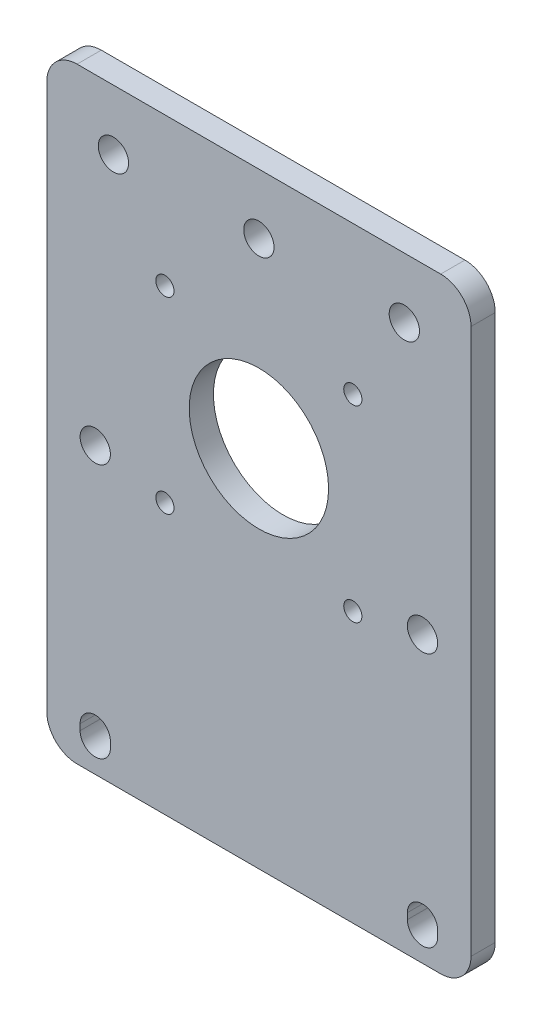
ISO-10303-21;
HEADER;
FILE_DESCRIPTION(('STEP AP214'),'2;1');
FILE_NAME('part.step','',(''),(''),'','','');
FILE_SCHEMA(('AUTOMOTIVE_DESIGN { 1 0 10303 214 1 1 1 1 }'));
ENDSEC;
DATA;
#1=APPLICATION_CONTEXT('core data for automotive mechanical design processes');
#2=APPLICATION_PROTOCOL_DEFINITION('international standard','automotive_design',2000,#1);
#3=PRODUCT_CONTEXT('',#1,'mechanical');
#4=PRODUCT('Part','Part','',(#3));
#5=PRODUCT_RELATED_PRODUCT_CATEGORY('part','',(#4));
#6=PRODUCT_DEFINITION_FORMATION('','',#4);
#7=PRODUCT_DEFINITION_CONTEXT('part definition',#1,'design');
#8=PRODUCT_DEFINITION('design','',#6,#7);
#9=PRODUCT_DEFINITION_SHAPE('','',#8);
#10=(LENGTH_UNIT() NAMED_UNIT(*) SI_UNIT(.MILLI.,.METRE.));
#11=(NAMED_UNIT(*) PLANE_ANGLE_UNIT() SI_UNIT($,.RADIAN.));
#12=(NAMED_UNIT(*) SI_UNIT($,.STERADIAN.) SOLID_ANGLE_UNIT());
#13=UNCERTAINTY_MEASURE_WITH_UNIT(LENGTH_MEASURE(1.E-05),#10,'distance_accuracy_value','');
#14=(GEOMETRIC_REPRESENTATION_CONTEXT(3) GLOBAL_UNCERTAINTY_ASSIGNED_CONTEXT((#13)) GLOBAL_UNIT_ASSIGNED_CONTEXT((#10,
#11,#12)) REPRESENTATION_CONTEXT('',''));
#15=CARTESIAN_POINT('',(0.,0.,0.));
#16=DIRECTION('',(0.,0.,1.));
#17=DIRECTION('',(1.,0.,0.));
#18=AXIS2_PLACEMENT_3D('',#15,#16,#17);
#19=CARTESIAN_POINT('',(0.,0.,4.));
#20=DIRECTION('',(0.,0.,1.));
#21=DIRECTION('',(1.,0.,0.));
#22=AXIS2_PLACEMENT_3D('',#19,#20,#21);
#23=PLANE('',#22);
#24=CARTESIAN_POINT('',(24.,40.076696830622,4.));
#25=DIRECTION('',(0.,0.,1.));
#26=DIRECTION('',(1.,0.,0.));
#27=AXIS2_PLACEMENT_3D('',#24,#25,#26);
#28=CIRCLE('',#27,2.5);
#29=CARTESIAN_POINT('',(26.5,40.076696830622,4.));
#30=VERTEX_POINT('',#29);
#31=EDGE_CURVE('E606',#30,#30,#28,.T.);
#32=ORIENTED_EDGE('',*,*,#31,.F.);
#33=EDGE_LOOP('',(#32));
#34=FACE_BOUND('',#33,.T.);
#35=CARTESIAN_POINT('',(-24.,40.076696830622,4.));
#36=DIRECTION('',(0.,0.,1.));
#37=DIRECTION('',(-1.,0.,0.));
#38=AXIS2_PLACEMENT_3D('',#35,#36,#37);
#39=CIRCLE('',#38,2.5);
#40=CARTESIAN_POINT('',(-26.5,40.076696830622,4.));
#41=VERTEX_POINT('',#40);
#42=EDGE_CURVE('E613',#41,#41,#39,.T.);
#43=ORIENTED_EDGE('',*,*,#42,.F.);
#44=EDGE_LOOP('',(#43));
#45=FACE_BOUND('',#44,.T.);
#46=CARTESIAN_POINT('',(0.,40.076696830622,4.));
#47=DIRECTION('',(0.,0.,1.));
#48=DIRECTION('',(1.,0.,0.));
#49=AXIS2_PLACEMENT_3D('',#46,#47,#48);
#50=CIRCLE('',#49,2.5);
#51=CARTESIAN_POINT('',(2.5,40.076696830622,4.));
#52=VERTEX_POINT('',#51);
#53=EDGE_CURVE('E619',#52,#52,#50,.T.);
#54=ORIENTED_EDGE('',*,*,#53,.F.);
#55=EDGE_LOOP('',(#54));
#56=FACE_BOUND('',#55,.T.);
#57=CARTESIAN_POINT('',(-15.5,-5.42330316937797,4.));
#58=DIRECTION('',(0.,0.,1.));
#59=DIRECTION('',(-1.,0.,0.));
#60=AXIS2_PLACEMENT_3D('',#57,#58,#59);
#61=CIRCLE('',#60,1.5);
#62=CARTESIAN_POINT('',(-17.,-5.42330316937797,4.));
#63=VERTEX_POINT('',#62);
#64=EDGE_CURVE('E624',#63,#63,#61,.T.);
#65=ORIENTED_EDGE('',*,*,#64,.F.);
#66=EDGE_LOOP('',(#65));
#67=FACE_BOUND('',#66,.T.);
#68=CARTESIAN_POINT('',(15.5,-5.42330316937798,4.));
#69=DIRECTION('',(0.,0.,1.));
#70=DIRECTION('',(1.,0.,0.));
#71=AXIS2_PLACEMENT_3D('',#68,#69,#70);
#72=CIRCLE('',#71,1.5);
#73=CARTESIAN_POINT('',(17.,-5.42330316937798,4.));
#74=VERTEX_POINT('',#73);
#75=EDGE_CURVE('E630',#74,#74,#72,.T.);
#76=ORIENTED_EDGE('',*,*,#75,.F.);
#77=EDGE_LOOP('',(#76));
#78=FACE_BOUND('',#77,.T.);
#79=CARTESIAN_POINT('',(15.5,25.576696830622,4.));
#80=DIRECTION('',(0.,0.,1.));
#81=DIRECTION('',(-1.,0.,0.));
#82=AXIS2_PLACEMENT_3D('',#79,#80,#81);
#83=CIRCLE('',#82,1.5);
#84=CARTESIAN_POINT('',(14.,25.576696830622,4.));
#85=VERTEX_POINT('',#84);
#86=EDGE_CURVE('E636',#85,#85,#83,.T.);
#87=ORIENTED_EDGE('',*,*,#86,.F.);
#88=EDGE_LOOP('',(#87));
#89=FACE_BOUND('',#88,.T.);
#90=CARTESIAN_POINT('',(-15.5,25.576696830622,4.));
#91=DIRECTION('',(0.,0.,1.));
#92=DIRECTION('',(1.,0.,0.));
#93=AXIS2_PLACEMENT_3D('',#90,#91,#92);
#94=CIRCLE('',#93,1.5);
#95=CARTESIAN_POINT('',(-14.,25.576696830622,4.));
#96=VERTEX_POINT('',#95);
#97=EDGE_CURVE('E642',#96,#96,#94,.T.);
#98=ORIENTED_EDGE('',*,*,#97,.F.);
#99=EDGE_LOOP('',(#98));
#100=FACE_BOUND('',#99,.T.);
#101=CARTESIAN_POINT('',(0.,10.076696830622,4.));
#102=DIRECTION('',(0.,0.,1.));
#103=DIRECTION('',(1.,0.,0.));
#104=AXIS2_PLACEMENT_3D('',#101,#102,#103);
#105=CIRCLE('',#104,11.5);
#106=CARTESIAN_POINT('',(11.5,10.076696830622,4.));
#107=VERTEX_POINT('',#106);
#108=EDGE_CURVE('E648',#107,#107,#105,.T.);
#109=ORIENTED_EDGE('',*,*,#108,.F.);
#110=EDGE_LOOP('',(#109));
#111=FACE_BOUND('',#110,.T.);
#112=DIRECTION('',(0.,-1.,0.));
#113=VECTOR('',#112,1.);
#114=CARTESIAN_POINT('',(24.5,-44.,4.));
#115=LINE('',#114,#113);
#116=CARTESIAN_POINT('',(24.5,-44.,4.));
#117=VERTEX_POINT('',#116);
#118=CARTESIAN_POINT('',(24.5,-45.,4.));
#119=VERTEX_POINT('',#118);
#120=EDGE_CURVE('E160',#117,#119,#115,.T.);
#121=ORIENTED_EDGE('',*,*,#120,.F.);
#122=CARTESIAN_POINT('',(27.,-44.,4.));
#123=DIRECTION('',(0.,0.,1.));
#124=DIRECTION('',(-1.,0.,0.));
#125=AXIS2_PLACEMENT_3D('',#122,#123,#124);
#126=CIRCLE('',#125,2.5);
#127=CARTESIAN_POINT('',(29.5,-44.,4.));
#128=VERTEX_POINT('',#127);
#129=EDGE_CURVE('E150',#128,#117,#126,.T.);
#130=ORIENTED_EDGE('',*,*,#129,.F.);
#131=DIRECTION('',(0.,1.,0.));
#132=VECTOR('',#131,1.);
#133=CARTESIAN_POINT('',(29.5,-44.,4.));
#134=LINE('',#133,#132);
#135=CARTESIAN_POINT('',(29.5,-45.,4.));
#136=VERTEX_POINT('',#135);
#137=EDGE_CURVE('E177',#136,#128,#134,.T.);
#138=ORIENTED_EDGE('',*,*,#137,.F.);
#139=CARTESIAN_POINT('',(27.,-45.,4.));
#140=DIRECTION('',(0.,0.,1.));
#141=DIRECTION('',(-1.,0.,0.));
#142=AXIS2_PLACEMENT_3D('',#139,#140,#141);
#143=CIRCLE('',#142,2.5);
#144=EDGE_CURVE('E174',#119,#136,#143,.T.);
#145=ORIENTED_EDGE('',*,*,#144,.F.);
#146=EDGE_LOOP('',(#121,#130,#138,#145));
#147=FACE_BOUND('',#146,.T.);
#148=DIRECTION('',(0.,-1.,0.));
#149=VECTOR('',#148,1.);
#150=CARTESIAN_POINT('',(-29.5,-44.,4.));
#151=LINE('',#150,#149);
#152=CARTESIAN_POINT('',(-29.5,-44.,4.));
#153=VERTEX_POINT('',#152);
#154=CARTESIAN_POINT('',(-29.5,-45.,4.));
#155=VERTEX_POINT('',#154);
#156=EDGE_CURVE('E197',#153,#155,#151,.T.);
#157=ORIENTED_EDGE('',*,*,#156,.F.);
#158=CARTESIAN_POINT('',(-27.,-44.,4.));
#159=DIRECTION('',(0.,0.,1.));
#160=DIRECTION('',(1.,0.,0.));
#161=AXIS2_PLACEMENT_3D('',#158,#159,#160);
#162=CIRCLE('',#161,2.5);
#163=CARTESIAN_POINT('',(-24.5,-44.,4.));
#164=VERTEX_POINT('',#163);
#165=EDGE_CURVE('E195',#164,#153,#162,.T.);
#166=ORIENTED_EDGE('',*,*,#165,.F.);
#167=DIRECTION('',(0.,1.,0.));
#168=VECTOR('',#167,1.);
#169=CARTESIAN_POINT('',(-24.5,-44.,4.));
#170=LINE('',#169,#168);
#171=CARTESIAN_POINT('',(-24.5,-45.,4.));
#172=VERTEX_POINT('',#171);
#173=EDGE_CURVE('E204',#172,#164,#170,.T.);
#174=ORIENTED_EDGE('',*,*,#173,.F.);
#175=CARTESIAN_POINT('',(-27.,-45.,4.));
#176=DIRECTION('',(0.,0.,1.));
#177=DIRECTION('',(1.,0.,0.));
#178=AXIS2_PLACEMENT_3D('',#175,#176,#177);
#179=CIRCLE('',#178,2.5);
#180=EDGE_CURVE('E200',#155,#172,#179,.T.);
#181=ORIENTED_EDGE('',*,*,#180,.F.);
#182=EDGE_LOOP('',(#157,#166,#174,#181));
#183=FACE_BOUND('',#182,.T.);
#184=CARTESIAN_POINT('',(-27.,-3.,4.));
#185=DIRECTION('',(0.,0.,1.));
#186=DIRECTION('',(1.,0.,0.));
#187=AXIS2_PLACEMENT_3D('',#184,#185,#186);
#188=CIRCLE('',#187,2.5);
#189=CARTESIAN_POINT('',(-24.5,-3.,4.));
#190=VERTEX_POINT('',#189);
#191=EDGE_CURVE('E227',#190,#190,#188,.T.);
#192=ORIENTED_EDGE('',*,*,#191,.F.);
#193=EDGE_LOOP('',(#192));
#194=FACE_BOUND('',#193,.T.);
#195=DIRECTION('',(0.,-1.,0.));
#196=VECTOR('',#195,1.);
#197=CARTESIAN_POINT('',(-35.,50.,4.));
#198=LINE('',#197,#196);
#199=CARTESIAN_POINT('',(-35.,45.,4.));
#200=VERTEX_POINT('',#199);
#201=CARTESIAN_POINT('',(-35.,-45.,4.));
#202=VERTEX_POINT('',#201);
#203=EDGE_CURVE('E239',#200,#202,#198,.T.);
#204=ORIENTED_EDGE('',*,*,#203,.T.);
#205=CARTESIAN_POINT('',(-30.,-45.,4.));
#206=DIRECTION('',(0.,0.,1.));
#207=DIRECTION('',(1.,0.,0.));
#208=AXIS2_PLACEMENT_3D('',#205,#206,#207);
#209=CIRCLE('',#208,5.);
#210=CARTESIAN_POINT('',(-30.,-50.,4.));
#211=VERTEX_POINT('',#210);
#212=EDGE_CURVE('E278',#202,#211,#209,.T.);
#213=ORIENTED_EDGE('',*,*,#212,.T.);
#214=DIRECTION('',(1.,0.,0.));
#215=VECTOR('',#214,1.);
#216=CARTESIAN_POINT('',(-35.,-50.,4.));
#217=LINE('',#216,#215);
#218=CARTESIAN_POINT('',(30.,-50.,4.));
#219=VERTEX_POINT('',#218);
#220=EDGE_CURVE('E243',#211,#219,#217,.T.);
#221=ORIENTED_EDGE('',*,*,#220,.T.);
#222=CARTESIAN_POINT('',(30.,-45.,4.));
#223=DIRECTION('',(0.,0.,1.));
#224=DIRECTION('',(1.,0.,0.));
#225=AXIS2_PLACEMENT_3D('',#222,#223,#224);
#226=CIRCLE('',#225,5.);
#227=CARTESIAN_POINT('',(35.,-45.,4.));
#228=VERTEX_POINT('',#227);
#229=EDGE_CURVE('E276',#219,#228,#226,.T.);
#230=ORIENTED_EDGE('',*,*,#229,.T.);
#231=DIRECTION('',(0.,1.,0.));
#232=VECTOR('',#231,1.);
#233=CARTESIAN_POINT('',(35.,50.,4.));
#234=LINE('',#233,#232);
#235=CARTESIAN_POINT('',(35.,45.,4.));
#236=VERTEX_POINT('',#235);
#237=EDGE_CURVE('E234',#228,#236,#234,.T.);
#238=ORIENTED_EDGE('',*,*,#237,.T.);
#239=CARTESIAN_POINT('',(30.,45.,4.));
#240=DIRECTION('',(0.,0.,1.));
#241=DIRECTION('',(1.,0.,0.));
#242=AXIS2_PLACEMENT_3D('',#239,#240,#241);
#243=CIRCLE('',#242,5.);
#244=CARTESIAN_POINT('',(30.,50.,4.));
#245=VERTEX_POINT('',#244);
#246=EDGE_CURVE('E56',#236,#245,#243,.T.);
#247=ORIENTED_EDGE('',*,*,#246,.T.);
#248=DIRECTION('',(-1.,0.,0.));
#249=VECTOR('',#248,1.);
#250=CARTESIAN_POINT('',(-35.,50.,4.));
#251=LINE('',#250,#249);
#252=CARTESIAN_POINT('',(-30.,50.,4.));
#253=VERTEX_POINT('',#252);
#254=EDGE_CURVE('E236',#245,#253,#251,.T.);
#255=ORIENTED_EDGE('',*,*,#254,.T.);
#256=CARTESIAN_POINT('',(-30.,45.,4.));
#257=DIRECTION('',(0.,0.,1.));
#258=DIRECTION('',(1.,0.,0.));
#259=AXIS2_PLACEMENT_3D('',#256,#257,#258);
#260=CIRCLE('',#259,5.);
#261=EDGE_CURVE('E273',#253,#200,#260,.T.);
#262=ORIENTED_EDGE('',*,*,#261,.T.);
#263=EDGE_LOOP('',(#204,#213,#221,#230,#238,#247,#255,#262));
#264=FACE_BOUND('',#263,.T.);
#265=CARTESIAN_POINT('',(27.,-3.,4.));
#266=DIRECTION('',(0.,0.,1.));
#267=DIRECTION('',(-1.,0.,0.));
#268=AXIS2_PLACEMENT_3D('',#265,#266,#267);
#269=CIRCLE('',#268,2.5);
#270=CARTESIAN_POINT('',(24.5,-3.,4.));
#271=VERTEX_POINT('',#270);
#272=EDGE_CURVE('E184',#271,#271,#269,.T.);
#273=ORIENTED_EDGE('',*,*,#272,.F.);
#274=EDGE_LOOP('',(#273));
#275=FACE_BOUND('',#274,.T.);
#276=ADVANCED_FACE('F35',(#34,#45,#56,#67,#78,#89,#100,#111,#147,#183,#194,#264,#275),#23,.T.);
#277=CARTESIAN_POINT('',(0.,0.,0.));
#278=DIRECTION('',(0.,0.,1.));
#279=DIRECTION('',(1.,0.,0.));
#280=AXIS2_PLACEMENT_3D('',#277,#278,#279);
#281=PLANE('',#280);
#282=CARTESIAN_POINT('',(24.,40.076696830622,0.));
#283=DIRECTION('',(0.,0.,1.));
#284=DIRECTION('',(1.,0.,0.));
#285=AXIS2_PLACEMENT_3D('',#282,#283,#284);
#286=CIRCLE('',#285,2.5);
#287=CARTESIAN_POINT('',(26.5,40.076696830622,0.));
#288=VERTEX_POINT('',#287);
#289=EDGE_CURVE('E610',#288,#288,#286,.T.);
#290=ORIENTED_EDGE('',*,*,#289,.T.);
#291=EDGE_LOOP('',(#290));
#292=FACE_BOUND('',#291,.T.);
#293=CARTESIAN_POINT('',(-24.,40.076696830622,0.));
#294=DIRECTION('',(0.,0.,1.));
#295=DIRECTION('',(-1.,0.,0.));
#296=AXIS2_PLACEMENT_3D('',#293,#294,#295);
#297=CIRCLE('',#296,2.5);
#298=CARTESIAN_POINT('',(-26.5,40.076696830622,0.));
#299=VERTEX_POINT('',#298);
#300=EDGE_CURVE('E611',#299,#299,#297,.T.);
#301=ORIENTED_EDGE('',*,*,#300,.T.);
#302=EDGE_LOOP('',(#301));
#303=FACE_BOUND('',#302,.T.);
#304=CARTESIAN_POINT('',(0.,40.076696830622,0.));
#305=DIRECTION('',(0.,0.,1.));
#306=DIRECTION('',(1.,0.,0.));
#307=AXIS2_PLACEMENT_3D('',#304,#305,#306);
#308=CIRCLE('',#307,2.5);
#309=CARTESIAN_POINT('',(2.5,40.076696830622,0.));
#310=VERTEX_POINT('',#309);
#311=EDGE_CURVE('E617',#310,#310,#308,.T.);
#312=ORIENTED_EDGE('',*,*,#311,.T.);
#313=EDGE_LOOP('',(#312));
#314=FACE_BOUND('',#313,.T.);
#315=CARTESIAN_POINT('',(-15.5,-5.42330316937797,0.));
#316=DIRECTION('',(0.,0.,1.));
#317=DIRECTION('',(-1.,0.,0.));
#318=AXIS2_PLACEMENT_3D('',#315,#316,#317);
#319=CIRCLE('',#318,1.5);
#320=CARTESIAN_POINT('',(-17.,-5.42330316937797,0.));
#321=VERTEX_POINT('',#320);
#322=EDGE_CURVE('E628',#321,#321,#319,.T.);
#323=ORIENTED_EDGE('',*,*,#322,.T.);
#324=EDGE_LOOP('',(#323));
#325=FACE_BOUND('',#324,.T.);
#326=CARTESIAN_POINT('',(15.5,-5.42330316937798,0.));
#327=DIRECTION('',(0.,0.,1.));
#328=DIRECTION('',(1.,0.,0.));
#329=AXIS2_PLACEMENT_3D('',#326,#327,#328);
#330=CIRCLE('',#329,1.5);
#331=CARTESIAN_POINT('',(17.,-5.42330316937798,0.));
#332=VERTEX_POINT('',#331);
#333=EDGE_CURVE('E634',#332,#332,#330,.T.);
#334=ORIENTED_EDGE('',*,*,#333,.T.);
#335=EDGE_LOOP('',(#334));
#336=FACE_BOUND('',#335,.T.);
#337=CARTESIAN_POINT('',(15.5,25.576696830622,0.));
#338=DIRECTION('',(0.,0.,1.));
#339=DIRECTION('',(-1.,0.,0.));
#340=AXIS2_PLACEMENT_3D('',#337,#338,#339);
#341=CIRCLE('',#340,1.5);
#342=CARTESIAN_POINT('',(14.,25.576696830622,0.));
#343=VERTEX_POINT('',#342);
#344=EDGE_CURVE('E640',#343,#343,#341,.T.);
#345=ORIENTED_EDGE('',*,*,#344,.T.);
#346=EDGE_LOOP('',(#345));
#347=FACE_BOUND('',#346,.T.);
#348=CARTESIAN_POINT('',(-15.5,25.576696830622,0.));
#349=DIRECTION('',(0.,0.,1.));
#350=DIRECTION('',(1.,0.,0.));
#351=AXIS2_PLACEMENT_3D('',#348,#349,#350);
#352=CIRCLE('',#351,1.5);
#353=CARTESIAN_POINT('',(-14.,25.576696830622,0.));
#354=VERTEX_POINT('',#353);
#355=EDGE_CURVE('E646',#354,#354,#352,.T.);
#356=ORIENTED_EDGE('',*,*,#355,.T.);
#357=EDGE_LOOP('',(#356));
#358=FACE_BOUND('',#357,.T.);
#359=CARTESIAN_POINT('',(0.,10.076696830622,0.));
#360=DIRECTION('',(0.,0.,1.));
#361=DIRECTION('',(1.,0.,0.));
#362=AXIS2_PLACEMENT_3D('',#359,#360,#361);
#363=CIRCLE('',#362,11.5);
#364=CARTESIAN_POINT('',(11.5,10.076696830622,0.));
#365=VERTEX_POINT('',#364);
#366=EDGE_CURVE('E651',#365,#365,#363,.T.);
#367=ORIENTED_EDGE('',*,*,#366,.T.);
#368=EDGE_LOOP('',(#367));
#369=FACE_BOUND('',#368,.T.);
#370=CARTESIAN_POINT('',(-27.,-44.,0.));
#371=DIRECTION('',(0.,0.,1.));
#372=DIRECTION('',(1.,0.,0.));
#373=AXIS2_PLACEMENT_3D('',#370,#371,#372);
#374=CIRCLE('',#373,2.5);
#375=CARTESIAN_POINT('',(-24.5,-44.,0.));
#376=VERTEX_POINT('',#375);
#377=CARTESIAN_POINT('',(-29.5,-44.,0.));
#378=VERTEX_POINT('',#377);
#379=EDGE_CURVE('E168',#376,#378,#374,.T.);
#380=ORIENTED_EDGE('',*,*,#379,.T.);
#381=DIRECTION('',(0.,-1.,0.));
#382=VECTOR('',#381,1.);
#383=CARTESIAN_POINT('',(-29.5,-44.,0.));
#384=LINE('',#383,#382);
#385=CARTESIAN_POINT('',(-29.5,-45.,0.));
#386=VERTEX_POINT('',#385);
#387=EDGE_CURVE('E209',#378,#386,#384,.T.);
#388=ORIENTED_EDGE('',*,*,#387,.T.);
#389=CARTESIAN_POINT('',(-27.,-45.,0.));
#390=DIRECTION('',(0.,0.,1.));
#391=DIRECTION('',(1.,0.,0.));
#392=AXIS2_PLACEMENT_3D('',#389,#390,#391);
#393=CIRCLE('',#392,2.5);
#394=CARTESIAN_POINT('',(-24.5,-45.,0.));
#395=VERTEX_POINT('',#394);
#396=EDGE_CURVE('E212',#386,#395,#393,.T.);
#397=ORIENTED_EDGE('',*,*,#396,.T.);
#398=DIRECTION('',(0.,1.,0.));
#399=VECTOR('',#398,1.);
#400=CARTESIAN_POINT('',(-24.5,-44.,0.));
#401=LINE('',#400,#399);
#402=EDGE_CURVE('E198',#395,#376,#401,.T.);
#403=ORIENTED_EDGE('',*,*,#402,.T.);
#404=EDGE_LOOP('',(#380,#388,#397,#403));
#405=FACE_BOUND('',#404,.T.);
#406=DIRECTION('',(1.,0.,0.));
#407=VECTOR('',#406,1.);
#408=CARTESIAN_POINT('',(-35.,-50.,0.));
#409=LINE('',#408,#407);
#410=CARTESIAN_POINT('',(-30.,-50.,0.));
#411=VERTEX_POINT('',#410);
#412=CARTESIAN_POINT('',(30.,-50.,0.));
#413=VERTEX_POINT('',#412);
#414=EDGE_CURVE('E237',#411,#413,#409,.T.);
#415=ORIENTED_EDGE('',*,*,#414,.F.);
#416=CARTESIAN_POINT('',(-30.,-45.,0.));
#417=DIRECTION('',(0.,0.,1.));
#418=DIRECTION('',(1.,0.,0.));
#419=AXIS2_PLACEMENT_3D('',#416,#417,#418);
#420=CIRCLE('',#419,5.);
#421=CARTESIAN_POINT('',(-35.,-45.,0.));
#422=VERTEX_POINT('',#421);
#423=EDGE_CURVE('E266',#411,#422,#420,.F.);
#424=ORIENTED_EDGE('',*,*,#423,.T.);
#425=DIRECTION('',(0.,-1.,0.));
#426=VECTOR('',#425,1.);
#427=CARTESIAN_POINT('',(-35.,50.,0.));
#428=LINE('',#427,#426);
#429=CARTESIAN_POINT('',(-35.,45.,0.));
#430=VERTEX_POINT('',#429);
#431=EDGE_CURVE('E251',#430,#422,#428,.T.);
#432=ORIENTED_EDGE('',*,*,#431,.F.);
#433=CARTESIAN_POINT('',(-30.,45.,0.));
#434=DIRECTION('',(0.,0.,1.));
#435=DIRECTION('',(1.,0.,0.));
#436=AXIS2_PLACEMENT_3D('',#433,#434,#435);
#437=CIRCLE('',#436,5.);
#438=CARTESIAN_POINT('',(-30.,50.,0.));
#439=VERTEX_POINT('',#438);
#440=EDGE_CURVE('E260',#430,#439,#437,.F.);
#441=ORIENTED_EDGE('',*,*,#440,.T.);
#442=DIRECTION('',(-1.,0.,0.));
#443=VECTOR('',#442,1.);
#444=CARTESIAN_POINT('',(-35.,50.,0.));
#445=LINE('',#444,#443);
#446=CARTESIAN_POINT('',(30.,50.,0.));
#447=VERTEX_POINT('',#446);
#448=EDGE_CURVE('E249',#447,#439,#445,.T.);
#449=ORIENTED_EDGE('',*,*,#448,.F.);
#450=CARTESIAN_POINT('',(30.,45.,0.));
#451=DIRECTION('',(0.,0.,1.));
#452=DIRECTION('',(1.,0.,0.));
#453=AXIS2_PLACEMENT_3D('',#450,#451,#452);
#454=CIRCLE('',#453,5.);
#455=CARTESIAN_POINT('',(35.,45.,0.));
#456=VERTEX_POINT('',#455);
#457=EDGE_CURVE('E262',#447,#456,#454,.F.);
#458=ORIENTED_EDGE('',*,*,#457,.T.);
#459=DIRECTION('',(0.,1.,0.));
#460=VECTOR('',#459,1.);
#461=CARTESIAN_POINT('',(35.,50.,0.));
#462=LINE('',#461,#460);
#463=CARTESIAN_POINT('',(35.,-45.,0.));
#464=VERTEX_POINT('',#463);
#465=EDGE_CURVE('E231',#464,#456,#462,.T.);
#466=ORIENTED_EDGE('',*,*,#465,.F.);
#467=CARTESIAN_POINT('',(30.,-45.,0.));
#468=DIRECTION('',(0.,0.,1.));
#469=DIRECTION('',(1.,0.,0.));
#470=AXIS2_PLACEMENT_3D('',#467,#468,#469);
#471=CIRCLE('',#470,5.);
#472=EDGE_CURVE('E264',#464,#413,#471,.F.);
#473=ORIENTED_EDGE('',*,*,#472,.T.);
#474=EDGE_LOOP('',(#415,#424,#432,#441,#449,#458,#466,#473));
#475=FACE_BOUND('',#474,.T.);
#476=CARTESIAN_POINT('',(-27.,-3.,0.));
#477=DIRECTION('',(0.,0.,1.));
#478=DIRECTION('',(1.,0.,0.));
#479=AXIS2_PLACEMENT_3D('',#476,#477,#478);
#480=CIRCLE('',#479,2.5);
#481=CARTESIAN_POINT('',(-24.5,-3.,0.));
#482=VERTEX_POINT('',#481);
#483=EDGE_CURVE('E226',#482,#482,#480,.T.);
#484=ORIENTED_EDGE('',*,*,#483,.T.);
#485=EDGE_LOOP('',(#484));
#486=FACE_BOUND('',#485,.T.);
#487=CARTESIAN_POINT('',(27.,-44.,0.));
#488=DIRECTION('',(0.,0.,1.));
#489=DIRECTION('',(-1.,0.,0.));
#490=AXIS2_PLACEMENT_3D('',#487,#488,#489);
#491=CIRCLE('',#490,2.5);
#492=CARTESIAN_POINT('',(29.5,-44.,0.));
#493=VERTEX_POINT('',#492);
#494=CARTESIAN_POINT('',(24.5,-44.,0.));
#495=VERTEX_POINT('',#494);
#496=EDGE_CURVE('E182',#493,#495,#491,.T.);
#497=ORIENTED_EDGE('',*,*,#496,.T.);
#498=DIRECTION('',(0.,-1.,0.));
#499=VECTOR('',#498,1.);
#500=CARTESIAN_POINT('',(24.5,-44.,0.));
#501=LINE('',#500,#499);
#502=CARTESIAN_POINT('',(24.5,-45.,0.));
#503=VERTEX_POINT('',#502);
#504=EDGE_CURVE('E167',#495,#503,#501,.T.);
#505=ORIENTED_EDGE('',*,*,#504,.T.);
#506=CARTESIAN_POINT('',(27.,-45.,0.));
#507=DIRECTION('',(0.,0.,1.));
#508=DIRECTION('',(-1.,0.,0.));
#509=AXIS2_PLACEMENT_3D('',#506,#507,#508);
#510=CIRCLE('',#509,2.5);
#511=CARTESIAN_POINT('',(29.5,-45.,0.));
#512=VERTEX_POINT('',#511);
#513=EDGE_CURVE('E186',#503,#512,#510,.T.);
#514=ORIENTED_EDGE('',*,*,#513,.T.);
#515=DIRECTION('',(0.,1.,0.));
#516=VECTOR('',#515,1.);
#517=CARTESIAN_POINT('',(29.5,-44.,0.));
#518=LINE('',#517,#516);
#519=EDGE_CURVE('E161',#512,#493,#518,.T.);
#520=ORIENTED_EDGE('',*,*,#519,.T.);
#521=EDGE_LOOP('',(#497,#505,#514,#520));
#522=FACE_BOUND('',#521,.T.);
#523=CARTESIAN_POINT('',(27.,-3.,0.));
#524=DIRECTION('',(0.,0.,1.));
#525=DIRECTION('',(-1.,0.,0.));
#526=AXIS2_PLACEMENT_3D('',#523,#524,#525);
#527=CIRCLE('',#526,2.5);
#528=CARTESIAN_POINT('',(24.5,-3.,0.));
#529=VERTEX_POINT('',#528);
#530=EDGE_CURVE('E659',#529,#529,#527,.T.);
#531=ORIENTED_EDGE('',*,*,#530,.T.);
#532=EDGE_LOOP('',(#531));
#533=FACE_BOUND('',#532,.T.);
#534=ADVANCED_FACE('F294',(#292,#303,#314,#325,#336,#347,#358,#369,#405,#475,#486,#522,#533),
#281,.F.);
#535=CARTESIAN_POINT('',(35.,50.,4.));
#536=DIRECTION('',(-1.,0.,0.));
#537=DIRECTION('',(0.,-1.,0.));
#538=AXIS2_PLACEMENT_3D('',#535,#536,#537);
#539=PLANE('',#538);
#540=ORIENTED_EDGE('',*,*,#237,.F.);
#541=DIRECTION('',(0.,0.,-1.));
#542=VECTOR('',#541,1.);
#543=CARTESIAN_POINT('',(35.,-45.,4.));
#544=LINE('',#543,#542);
#545=EDGE_CURVE('E282',#228,#464,#544,.T.);
#546=ORIENTED_EDGE('',*,*,#545,.T.);
#547=ORIENTED_EDGE('',*,*,#465,.T.);
#548=DIRECTION('',(0.,0.,-1.));
#549=VECTOR('',#548,1.);
#550=CARTESIAN_POINT('',(35.,45.,4.));
#551=LINE('',#550,#549);
#552=EDGE_CURVE('E280',#456,#236,#551,.F.);
#553=ORIENTED_EDGE('',*,*,#552,.T.);
#554=EDGE_LOOP('',(#540,#546,#547,#553));
#555=FACE_BOUND('',#554,.T.);
#556=ADVANCED_FACE('F288',(#555),#539,.F.);
#557=CARTESIAN_POINT('',(-35.,50.,4.));
#558=DIRECTION('',(0.,-1.,0.));
#559=DIRECTION('',(0.,0.,-1.));
#560=AXIS2_PLACEMENT_3D('',#557,#558,#559);
#561=PLANE('',#560);
#562=ORIENTED_EDGE('',*,*,#254,.F.);
#563=DIRECTION('',(0.,0.,-1.));
#564=VECTOR('',#563,1.);
#565=CARTESIAN_POINT('',(30.,50.,4.));
#566=LINE('',#565,#564);
#567=EDGE_CURVE('E11',#245,#447,#566,.T.);
#568=ORIENTED_EDGE('',*,*,#567,.T.);
#569=ORIENTED_EDGE('',*,*,#448,.T.);
#570=DIRECTION('',(0.,0.,-1.));
#571=VECTOR('',#570,1.);
#572=CARTESIAN_POINT('',(-30.,50.,4.));
#573=LINE('',#572,#571);
#574=EDGE_CURVE('E43',#439,#253,#573,.F.);
#575=ORIENTED_EDGE('',*,*,#574,.T.);
#576=EDGE_LOOP('',(#562,#568,#569,#575));
#577=FACE_BOUND('',#576,.T.);
#578=ADVANCED_FACE('F300',(#577),#561,.F.);
#579=CARTESIAN_POINT('',(-35.,50.,4.));
#580=DIRECTION('',(1.,0.,0.));
#581=DIRECTION('',(0.,1.,0.));
#582=AXIS2_PLACEMENT_3D('',#579,#580,#581);
#583=PLANE('',#582);
#584=ORIENTED_EDGE('',*,*,#431,.T.);
#585=DIRECTION('',(0.,0.,-1.));
#586=VECTOR('',#585,1.);
#587=CARTESIAN_POINT('',(-35.,-45.,4.));
#588=LINE('',#587,#586);
#589=EDGE_CURVE('E271',#422,#202,#588,.F.);
#590=ORIENTED_EDGE('',*,*,#589,.T.);
#591=ORIENTED_EDGE('',*,*,#203,.F.);
#592=DIRECTION('',(0.,0.,-1.));
#593=VECTOR('',#592,1.);
#594=CARTESIAN_POINT('',(-35.,45.,4.));
#595=LINE('',#594,#593);
#596=EDGE_CURVE('E268',#200,#430,#595,.T.);
#597=ORIENTED_EDGE('',*,*,#596,.T.);
#598=EDGE_LOOP('',(#584,#590,#591,#597));
#599=FACE_BOUND('',#598,.T.);
#600=ADVANCED_FACE('F308',(#599),#583,.F.);
#601=CARTESIAN_POINT('',(-35.,-50.,4.));
#602=DIRECTION('',(0.,1.,0.));
#603=DIRECTION('',(0.,0.,1.));
#604=AXIS2_PLACEMENT_3D('',#601,#602,#603);
#605=PLANE('',#604);
#606=ORIENTED_EDGE('',*,*,#220,.F.);
#607=DIRECTION('',(0.,0.,-1.));
#608=VECTOR('',#607,1.);
#609=CARTESIAN_POINT('',(-30.,-50.,4.));
#610=LINE('',#609,#608);
#611=EDGE_CURVE('E257',#211,#411,#610,.T.);
#612=ORIENTED_EDGE('',*,*,#611,.T.);
#613=ORIENTED_EDGE('',*,*,#414,.T.);
#614=DIRECTION('',(0.,0.,-1.));
#615=VECTOR('',#614,1.);
#616=CARTESIAN_POINT('',(30.,-50.,4.));
#617=LINE('',#616,#615);
#618=EDGE_CURVE('E246',#413,#219,#617,.F.);
#619=ORIENTED_EDGE('',*,*,#618,.T.);
#620=EDGE_LOOP('',(#606,#612,#613,#619));
#621=FACE_BOUND('',#620,.T.);
#622=ADVANCED_FACE('F316',(#621),#605,.F.);
#623=CARTESIAN_POINT('',(-27.,-3.,4.));
#624=DIRECTION('',(0.,0.,-1.));
#625=DIRECTION('',(-1.,0.,0.));
#626=AXIS2_PLACEMENT_3D('',#623,#624,#625);
#627=CYLINDRICAL_SURFACE('',#626,2.5);
#628=ORIENTED_EDGE('',*,*,#191,.T.);
#629=EDGE_LOOP('',(#628));
#630=FACE_BOUND('',#629,.T.);
#631=ORIENTED_EDGE('',*,*,#483,.F.);
#632=EDGE_LOOP('',(#631));
#633=FACE_BOUND('',#632,.T.);
#634=ADVANCED_FACE('F338',(#630,#633),#627,.F.);
#635=CARTESIAN_POINT('',(-27.,-44.,4.));
#636=DIRECTION('',(0.,0.,-1.));
#637=DIRECTION('',(-1.,0.,0.));
#638=AXIS2_PLACEMENT_3D('',#635,#636,#637);
#639=CYLINDRICAL_SURFACE('',#638,2.5);
#640=ORIENTED_EDGE('',*,*,#379,.F.);
#641=DIRECTION('',(0.,0.,-1.));
#642=VECTOR('',#641,1.);
#643=CARTESIAN_POINT('',(-24.5,-44.,4.));
#644=LINE('',#643,#642);
#645=EDGE_CURVE('E206',#164,#376,#644,.T.);
#646=ORIENTED_EDGE('',*,*,#645,.F.);
#647=ORIENTED_EDGE('',*,*,#165,.T.);
#648=DIRECTION('',(0.,0.,-1.));
#649=VECTOR('',#648,1.);
#650=CARTESIAN_POINT('',(-29.5,-44.,4.));
#651=LINE('',#650,#649);
#652=EDGE_CURVE('E223',#153,#378,#651,.T.);
#653=ORIENTED_EDGE('',*,*,#652,.T.);
#654=EDGE_LOOP('',(#640,#646,#647,#653));
#655=FACE_BOUND('',#654,.T.);
#656=ADVANCED_FACE('F372',(#655),#639,.F.);
#657=CARTESIAN_POINT('',(-29.5,-44.,4.));
#658=DIRECTION('',(1.,0.,0.));
#659=DIRECTION('',(0.,1.,0.));
#660=AXIS2_PLACEMENT_3D('',#657,#658,#659);
#661=PLANE('',#660);
#662=ORIENTED_EDGE('',*,*,#387,.F.);
#663=ORIENTED_EDGE('',*,*,#652,.F.);
#664=ORIENTED_EDGE('',*,*,#156,.T.);
#665=DIRECTION('',(0.,0.,-1.));
#666=VECTOR('',#665,1.);
#667=CARTESIAN_POINT('',(-29.5,-45.,4.));
#668=LINE('',#667,#666);
#669=EDGE_CURVE('E221',#155,#386,#668,.T.);
#670=ORIENTED_EDGE('',*,*,#669,.T.);
#671=EDGE_LOOP('',(#662,#663,#664,#670));
#672=FACE_BOUND('',#671,.T.);
#673=ADVANCED_FACE('F381',(#672),#661,.T.);
#674=CARTESIAN_POINT('',(-27.,-45.,4.));
#675=DIRECTION('',(0.,0.,-1.));
#676=DIRECTION('',(-1.,0.,0.));
#677=AXIS2_PLACEMENT_3D('',#674,#675,#676);
#678=CYLINDRICAL_SURFACE('',#677,2.5);
#679=ORIENTED_EDGE('',*,*,#396,.F.);
#680=ORIENTED_EDGE('',*,*,#669,.F.);
#681=ORIENTED_EDGE('',*,*,#180,.T.);
#682=DIRECTION('',(0.,0.,-1.));
#683=VECTOR('',#682,1.);
#684=CARTESIAN_POINT('',(-24.5,-45.,4.));
#685=LINE('',#684,#683);
#686=EDGE_CURVE('E219',#172,#395,#685,.T.);
#687=ORIENTED_EDGE('',*,*,#686,.T.);
#688=EDGE_LOOP('',(#679,#680,#681,#687));
#689=FACE_BOUND('',#688,.T.);
#690=ADVANCED_FACE('F388',(#689),#678,.F.);
#691=CARTESIAN_POINT('',(-24.5,-44.,4.));
#692=DIRECTION('',(-1.,0.,0.));
#693=DIRECTION('',(0.,-1.,0.));
#694=AXIS2_PLACEMENT_3D('',#691,#692,#693);
#695=PLANE('',#694);
#696=ORIENTED_EDGE('',*,*,#402,.F.);
#697=ORIENTED_EDGE('',*,*,#686,.F.);
#698=ORIENTED_EDGE('',*,*,#173,.T.);
#699=ORIENTED_EDGE('',*,*,#645,.T.);
#700=EDGE_LOOP('',(#696,#697,#698,#699));
#701=FACE_BOUND('',#700,.T.);
#702=ADVANCED_FACE('F396',(#701),#695,.T.);
#703=CARTESIAN_POINT('',(27.,-44.,4.));
#704=DIRECTION('',(0.,0.,-1.));
#705=DIRECTION('',(-1.,0.,0.));
#706=AXIS2_PLACEMENT_3D('',#703,#704,#705);
#707=CYLINDRICAL_SURFACE('',#706,2.5);
#708=ORIENTED_EDGE('',*,*,#496,.F.);
#709=DIRECTION('',(0.,0.,-1.));
#710=VECTOR('',#709,1.);
#711=CARTESIAN_POINT('',(29.5,-44.,4.));
#712=LINE('',#711,#710);
#713=EDGE_CURVE('E156',#128,#493,#712,.T.);
#714=ORIENTED_EDGE('',*,*,#713,.F.);
#715=ORIENTED_EDGE('',*,*,#129,.T.);
#716=DIRECTION('',(0.,0.,-1.));
#717=VECTOR('',#716,1.);
#718=CARTESIAN_POINT('',(24.5,-44.,4.));
#719=LINE('',#718,#717);
#720=EDGE_CURVE('E153',#117,#495,#719,.T.);
#721=ORIENTED_EDGE('',*,*,#720,.T.);
#722=EDGE_LOOP('',(#708,#714,#715,#721));
#723=FACE_BOUND('',#722,.T.);
#724=ADVANCED_FACE('F152',(#723),#707,.F.);
#725=CARTESIAN_POINT('',(24.5,-44.,4.));
#726=DIRECTION('',(1.,0.,0.));
#727=DIRECTION('',(0.,1.,0.));
#728=AXIS2_PLACEMENT_3D('',#725,#726,#727);
#729=PLANE('',#728);
#730=ORIENTED_EDGE('',*,*,#504,.F.);
#731=ORIENTED_EDGE('',*,*,#720,.F.);
#732=ORIENTED_EDGE('',*,*,#120,.T.);
#733=DIRECTION('',(0.,0.,-1.));
#734=VECTOR('',#733,1.);
#735=CARTESIAN_POINT('',(24.5,-45.,4.));
#736=LINE('',#735,#734);
#737=EDGE_CURVE('E169',#119,#503,#736,.T.);
#738=ORIENTED_EDGE('',*,*,#737,.T.);
#739=EDGE_LOOP('',(#730,#731,#732,#738));
#740=FACE_BOUND('',#739,.T.);
#741=ADVANCED_FACE('F164',(#740),#729,.T.);
#742=CARTESIAN_POINT('',(27.,-45.,4.));
#743=DIRECTION('',(0.,0.,-1.));
#744=DIRECTION('',(-1.,0.,0.));
#745=AXIS2_PLACEMENT_3D('',#742,#743,#744);
#746=CYLINDRICAL_SURFACE('',#745,2.5);
#747=ORIENTED_EDGE('',*,*,#513,.F.);
#748=ORIENTED_EDGE('',*,*,#737,.F.);
#749=ORIENTED_EDGE('',*,*,#144,.T.);
#750=DIRECTION('',(0.,0.,-1.));
#751=VECTOR('',#750,1.);
#752=CARTESIAN_POINT('',(29.5,-45.,4.));
#753=LINE('',#752,#751);
#754=EDGE_CURVE('E192',#136,#512,#753,.T.);
#755=ORIENTED_EDGE('',*,*,#754,.T.);
#756=EDGE_LOOP('',(#747,#748,#749,#755));
#757=FACE_BOUND('',#756,.T.);
#758=ADVANCED_FACE('F417',(#757),#746,.F.);
#759=CARTESIAN_POINT('',(29.5,-44.,4.));
#760=DIRECTION('',(-1.,0.,0.));
#761=DIRECTION('',(0.,-1.,0.));
#762=AXIS2_PLACEMENT_3D('',#759,#760,#761);
#763=PLANE('',#762);
#764=ORIENTED_EDGE('',*,*,#519,.F.);
#765=ORIENTED_EDGE('',*,*,#754,.F.);
#766=ORIENTED_EDGE('',*,*,#137,.T.);
#767=ORIENTED_EDGE('',*,*,#713,.T.);
#768=EDGE_LOOP('',(#764,#765,#766,#767));
#769=FACE_BOUND('',#768,.T.);
#770=ADVANCED_FACE('F424',(#769),#763,.T.);
#771=CARTESIAN_POINT('',(27.,-3.,4.));
#772=DIRECTION('',(0.,0.,-1.));
#773=DIRECTION('',(-1.,0.,0.));
#774=AXIS2_PLACEMENT_3D('',#771,#772,#773);
#775=CYLINDRICAL_SURFACE('',#774,2.5);
#776=ORIENTED_EDGE('',*,*,#272,.T.);
#777=EDGE_LOOP('',(#776));
#778=FACE_BOUND('',#777,.T.);
#779=ORIENTED_EDGE('',*,*,#530,.F.);
#780=EDGE_LOOP('',(#779));
#781=FACE_BOUND('',#780,.T.);
#782=ADVANCED_FACE('F432',(#778,#781),#775,.F.);
#783=CARTESIAN_POINT('',(0.,10.076696830622,0.));
#784=DIRECTION('',(0.,0.,1.));
#785=DIRECTION('',(1.,0.,0.));
#786=AXIS2_PLACEMENT_3D('',#783,#784,#785);
#787=CYLINDRICAL_SURFACE('',#786,11.5);
#788=ORIENTED_EDGE('',*,*,#366,.F.);
#789=EDGE_LOOP('',(#788));
#790=FACE_BOUND('',#789,.T.);
#791=ORIENTED_EDGE('',*,*,#108,.T.);
#792=EDGE_LOOP('',(#791));
#793=FACE_BOUND('',#792,.T.);
#794=ADVANCED_FACE('F440',(#790,#793),#787,.F.);
#795=CARTESIAN_POINT('',(-15.5,25.576696830622,0.));
#796=DIRECTION('',(0.,0.,1.));
#797=DIRECTION('',(1.,0.,0.));
#798=AXIS2_PLACEMENT_3D('',#795,#796,#797);
#799=CYLINDRICAL_SURFACE('',#798,1.5);
#800=ORIENTED_EDGE('',*,*,#355,.F.);
#801=EDGE_LOOP('',(#800));
#802=FACE_BOUND('',#801,.T.);
#803=ORIENTED_EDGE('',*,*,#97,.T.);
#804=EDGE_LOOP('',(#803));
#805=FACE_BOUND('',#804,.T.);
#806=ADVANCED_FACE('F446',(#802,#805),#799,.F.);
#807=CARTESIAN_POINT('',(15.5,25.576696830622,0.));
#808=DIRECTION('',(0.,0.,1.));
#809=DIRECTION('',(1.,0.,0.));
#810=AXIS2_PLACEMENT_3D('',#807,#808,#809);
#811=CYLINDRICAL_SURFACE('',#810,1.5);
#812=ORIENTED_EDGE('',*,*,#344,.F.);
#813=EDGE_LOOP('',(#812));
#814=FACE_BOUND('',#813,.T.);
#815=ORIENTED_EDGE('',*,*,#86,.T.);
#816=EDGE_LOOP('',(#815));
#817=FACE_BOUND('',#816,.T.);
#818=ADVANCED_FACE('F454',(#814,#817),#811,.F.);
#819=CARTESIAN_POINT('',(15.5,-5.42330316937798,0.));
#820=DIRECTION('',(0.,0.,1.));
#821=DIRECTION('',(1.,0.,0.));
#822=AXIS2_PLACEMENT_3D('',#819,#820,#821);
#823=CYLINDRICAL_SURFACE('',#822,1.5);
#824=ORIENTED_EDGE('',*,*,#333,.F.);
#825=EDGE_LOOP('',(#824));
#826=FACE_BOUND('',#825,.T.);
#827=ORIENTED_EDGE('',*,*,#75,.T.);
#828=EDGE_LOOP('',(#827));
#829=FACE_BOUND('',#828,.T.);
#830=ADVANCED_FACE('F462',(#826,#829),#823,.F.);
#831=CARTESIAN_POINT('',(-15.5,-5.42330316937797,0.));
#832=DIRECTION('',(0.,0.,1.));
#833=DIRECTION('',(1.,0.,0.));
#834=AXIS2_PLACEMENT_3D('',#831,#832,#833);
#835=CYLINDRICAL_SURFACE('',#834,1.5);
#836=ORIENTED_EDGE('',*,*,#322,.F.);
#837=EDGE_LOOP('',(#836));
#838=FACE_BOUND('',#837,.T.);
#839=ORIENTED_EDGE('',*,*,#64,.T.);
#840=EDGE_LOOP('',(#839));
#841=FACE_BOUND('',#840,.T.);
#842=ADVANCED_FACE('F470',(#838,#841),#835,.F.);
#843=CARTESIAN_POINT('',(0.,40.076696830622,0.));
#844=DIRECTION('',(0.,0.,1.));
#845=DIRECTION('',(1.,0.,0.));
#846=AXIS2_PLACEMENT_3D('',#843,#844,#845);
#847=CYLINDRICAL_SURFACE('',#846,2.5);
#848=ORIENTED_EDGE('',*,*,#311,.F.);
#849=EDGE_LOOP('',(#848));
#850=FACE_BOUND('',#849,.T.);
#851=ORIENTED_EDGE('',*,*,#53,.T.);
#852=EDGE_LOOP('',(#851));
#853=FACE_BOUND('',#852,.T.);
#854=ADVANCED_FACE('F478',(#850,#853),#847,.F.);
#855=CARTESIAN_POINT('',(-24.,40.076696830622,0.));
#856=DIRECTION('',(0.,0.,1.));
#857=DIRECTION('',(1.,0.,0.));
#858=AXIS2_PLACEMENT_3D('',#855,#856,#857);
#859=CYLINDRICAL_SURFACE('',#858,2.5);
#860=ORIENTED_EDGE('',*,*,#300,.F.);
#861=EDGE_LOOP('',(#860));
#862=FACE_BOUND('',#861,.T.);
#863=ORIENTED_EDGE('',*,*,#42,.T.);
#864=EDGE_LOOP('',(#863));
#865=FACE_BOUND('',#864,.T.);
#866=ADVANCED_FACE('F486',(#862,#865),#859,.F.);
#867=CARTESIAN_POINT('',(24.,40.076696830622,0.));
#868=DIRECTION('',(0.,0.,1.));
#869=DIRECTION('',(1.,0.,0.));
#870=AXIS2_PLACEMENT_3D('',#867,#868,#869);
#871=CYLINDRICAL_SURFACE('',#870,2.5);
#872=ORIENTED_EDGE('',*,*,#289,.F.);
#873=EDGE_LOOP('',(#872));
#874=FACE_BOUND('',#873,.T.);
#875=ORIENTED_EDGE('',*,*,#31,.T.);
#876=EDGE_LOOP('',(#875));
#877=FACE_BOUND('',#876,.T.);
#878=ADVANCED_FACE('F325',(#874,#877),#871,.F.);
#879=CARTESIAN_POINT('',(-30.,-45.,4.));
#880=DIRECTION('',(0.,0.,-1.));
#881=DIRECTION('',(-1.,0.,0.));
#882=AXIS2_PLACEMENT_3D('',#879,#880,#881);
#883=CYLINDRICAL_SURFACE('',#882,5.);
#884=ORIENTED_EDGE('',*,*,#212,.F.);
#885=ORIENTED_EDGE('',*,*,#589,.F.);
#886=ORIENTED_EDGE('',*,*,#423,.F.);
#887=ORIENTED_EDGE('',*,*,#611,.F.);
#888=EDGE_LOOP('',(#884,#885,#886,#887));
#889=FACE_BOUND('',#888,.T.);
#890=ADVANCED_FACE('F313',(#889),#883,.T.);
#891=CARTESIAN_POINT('',(30.,-45.,4.));
#892=DIRECTION('',(0.,0.,-1.));
#893=DIRECTION('',(-1.,0.,0.));
#894=AXIS2_PLACEMENT_3D('',#891,#892,#893);
#895=CYLINDRICAL_SURFACE('',#894,5.);
#896=ORIENTED_EDGE('',*,*,#229,.F.);
#897=ORIENTED_EDGE('',*,*,#618,.F.);
#898=ORIENTED_EDGE('',*,*,#472,.F.);
#899=ORIENTED_EDGE('',*,*,#545,.F.);
#900=EDGE_LOOP('',(#896,#897,#898,#899));
#901=FACE_BOUND('',#900,.T.);
#902=ADVANCED_FACE('F318',(#901),#895,.T.);
#903=CARTESIAN_POINT('',(30.,45.,4.));
#904=DIRECTION('',(0.,0.,-1.));
#905=DIRECTION('',(-1.,0.,0.));
#906=AXIS2_PLACEMENT_3D('',#903,#904,#905);
#907=CYLINDRICAL_SURFACE('',#906,5.);
#908=ORIENTED_EDGE('',*,*,#246,.F.);
#909=ORIENTED_EDGE('',*,*,#552,.F.);
#910=ORIENTED_EDGE('',*,*,#457,.F.);
#911=ORIENTED_EDGE('',*,*,#567,.F.);
#912=EDGE_LOOP('',(#908,#909,#910,#911));
#913=FACE_BOUND('',#912,.T.);
#914=ADVANCED_FACE('F299',(#913),#907,.T.);
#915=CARTESIAN_POINT('',(-30.,45.,4.));
#916=DIRECTION('',(0.,0.,-1.));
#917=DIRECTION('',(-1.,0.,0.));
#918=AXIS2_PLACEMENT_3D('',#915,#916,#917);
#919=CYLINDRICAL_SURFACE('',#918,5.);
#920=ORIENTED_EDGE('',*,*,#261,.F.);
#921=ORIENTED_EDGE('',*,*,#574,.F.);
#922=ORIENTED_EDGE('',*,*,#440,.F.);
#923=ORIENTED_EDGE('',*,*,#596,.F.);
#924=EDGE_LOOP('',(#920,#921,#922,#923));
#925=FACE_BOUND('',#924,.T.);
#926=ADVANCED_FACE('F37',(#925),#919,.T.);
#927=CLOSED_SHELL('',(#276,#534,#556,#578,#600,#622,#634,#656,#673,#690,#702,#724,#741,#758,
#770,#782,#794,#806,#818,#830,#842,#854,#866,#878,#890,#902,#914,#926));
#928=MANIFOLD_SOLID_BREP('B2',#927);
#929=ADVANCED_BREP_SHAPE_REPRESENTATION('',(#18,#928),#14);
#930=SHAPE_DEFINITION_REPRESENTATION(#9,#929);
ENDSEC;
END-ISO-10303-21;
